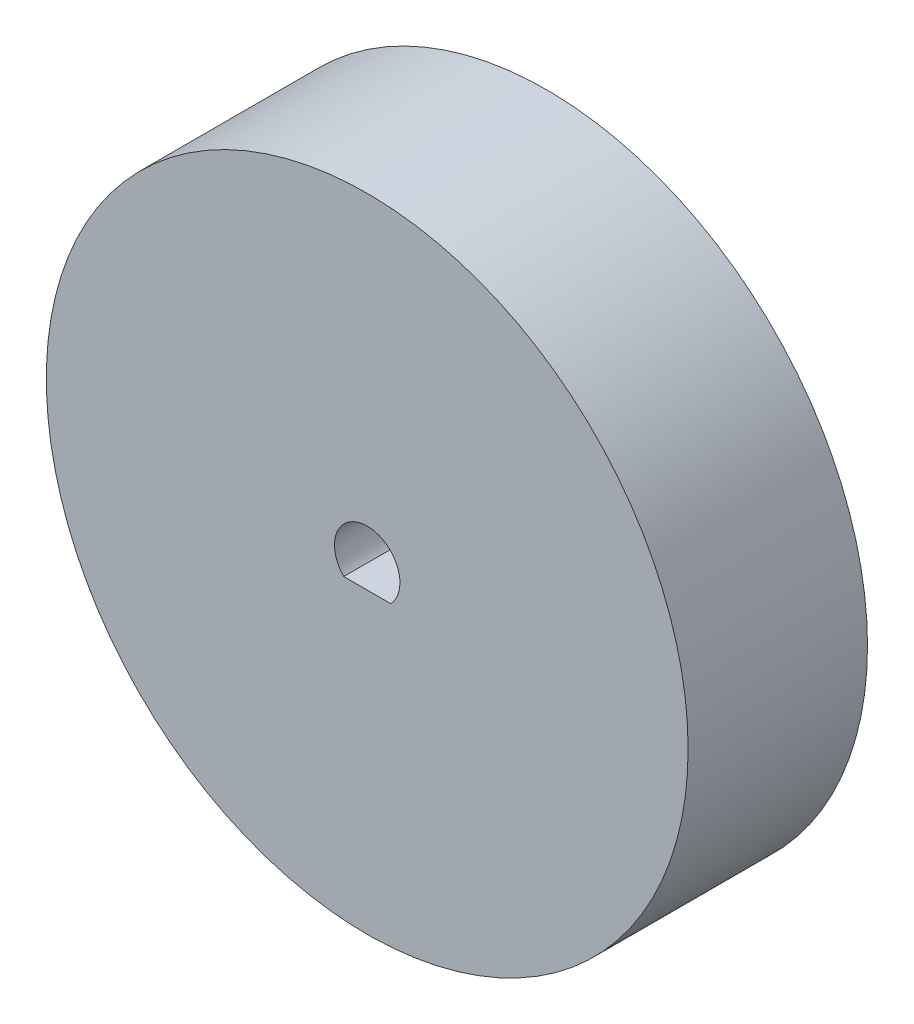
ISO-10303-21;
HEADER;
FILE_DESCRIPTION(('STEP AP214'),'2;1');
FILE_NAME('part.step','',(''),(''),'','','');
FILE_SCHEMA(('AUTOMOTIVE_DESIGN { 1 0 10303 214 1 1 1 1 }'));
ENDSEC;
DATA;
#1=APPLICATION_CONTEXT('core data for automotive mechanical design processes');
#2=APPLICATION_PROTOCOL_DEFINITION('international standard','automotive_design',2000,#1);
#3=PRODUCT_CONTEXT('',#1,'mechanical');
#4=PRODUCT('Part','Part','',(#3));
#5=PRODUCT_RELATED_PRODUCT_CATEGORY('part','',(#4));
#6=PRODUCT_DEFINITION_FORMATION('','',#4);
#7=PRODUCT_DEFINITION_CONTEXT('part definition',#1,'design');
#8=PRODUCT_DEFINITION('design','',#6,#7);
#9=PRODUCT_DEFINITION_SHAPE('','',#8);
#10=(LENGTH_UNIT() NAMED_UNIT(*) SI_UNIT(.MILLI.,.METRE.));
#11=(NAMED_UNIT(*) PLANE_ANGLE_UNIT() SI_UNIT($,.RADIAN.));
#12=(NAMED_UNIT(*) SI_UNIT($,.STERADIAN.) SOLID_ANGLE_UNIT());
#13=UNCERTAINTY_MEASURE_WITH_UNIT(LENGTH_MEASURE(1.E-05),#10,'distance_accuracy_value','');
#14=(GEOMETRIC_REPRESENTATION_CONTEXT(3) GLOBAL_UNCERTAINTY_ASSIGNED_CONTEXT((#13)) GLOBAL_UNIT_ASSIGNED_CONTEXT((#10,
#11,#12)) REPRESENTATION_CONTEXT('',''));
#15=CARTESIAN_POINT('',(0.,0.,0.));
#16=DIRECTION('',(0.,0.,1.));
#17=DIRECTION('',(1.,0.,0.));
#18=AXIS2_PLACEMENT_3D('',#15,#16,#17);
#19=CARTESIAN_POINT('',(0.,0.,9.));
#20=DIRECTION('',(0.,0.,1.));
#21=DIRECTION('',(1.,0.,0.));
#22=AXIS2_PLACEMENT_3D('',#19,#20,#21);
#23=PLANE('',#22);
#24=CARTESIAN_POINT('',(0.,0.,9.));
#25=DIRECTION('',(0.,0.,1.));
#26=DIRECTION('',(1.,0.,0.));
#27=AXIS2_PLACEMENT_3D('',#24,#25,#26);
#28=CIRCLE('',#27,16.1);
#29=CARTESIAN_POINT('',(16.1,0.,9.));
#30=VERTEX_POINT('',#29);
#31=EDGE_CURVE('E11',#30,#30,#28,.T.);
#32=ORIENTED_EDGE('',*,*,#31,.T.);
#33=EDGE_LOOP('',(#32));
#34=FACE_BOUND('',#33,.T.);
#35=DIRECTION('',(1.,0.,0.));
#36=VECTOR('',#35,1.);
#37=CARTESIAN_POINT('',(-1.17898261225516,-1.14,9.));
#38=LINE('',#37,#36);
#39=CARTESIAN_POINT('',(-1.17898261225516,-1.14,9.));
#40=VERTEX_POINT('',#39);
#41=CARTESIAN_POINT('',(1.17898261225516,-1.14,9.));
#42=VERTEX_POINT('',#41);
#43=EDGE_CURVE('E78',#40,#42,#38,.T.);
#44=ORIENTED_EDGE('',*,*,#43,.F.);
#45=CARTESIAN_POINT('',(0.,0.,9.));
#46=DIRECTION('',(0.,0.,1.));
#47=DIRECTION('',(1.,0.,0.));
#48=AXIS2_PLACEMENT_3D('',#45,#46,#47);
#49=CIRCLE('',#48,1.64);
#50=EDGE_CURVE('E69',#42,#40,#49,.T.);
#51=ORIENTED_EDGE('',*,*,#50,.F.);
#52=EDGE_LOOP('',(#44,#51));
#53=FACE_BOUND('',#52,.T.);
#54=ADVANCED_FACE('F37',(#34,#53),#23,.T.);
#55=CARTESIAN_POINT('',(0.,0.,0.));
#56=DIRECTION('',(0.,0.,1.));
#57=DIRECTION('',(1.,0.,0.));
#58=AXIS2_PLACEMENT_3D('',#55,#56,#57);
#59=PLANE('',#58);
#60=CARTESIAN_POINT('',(0.,0.,0.));
#61=DIRECTION('',(0.,0.,1.));
#62=DIRECTION('',(1.,0.,0.));
#63=AXIS2_PLACEMENT_3D('',#60,#61,#62);
#64=CIRCLE('',#63,16.1);
#65=CARTESIAN_POINT('',(16.1,0.,0.));
#66=VERTEX_POINT('',#65);
#67=EDGE_CURVE('E41',#66,#66,#64,.T.);
#68=ORIENTED_EDGE('',*,*,#67,.F.);
#69=EDGE_LOOP('',(#68));
#70=FACE_BOUND('',#69,.T.);
#71=CARTESIAN_POINT('',(0.,0.,0.));
#72=DIRECTION('',(0.,0.,1.));
#73=DIRECTION('',(1.,0.,0.));
#74=AXIS2_PLACEMENT_3D('',#71,#72,#73);
#75=CIRCLE('',#74,1.64);
#76=CARTESIAN_POINT('',(1.17898261225516,-1.14,0.));
#77=VERTEX_POINT('',#76);
#78=CARTESIAN_POINT('',(-1.17898261225516,-1.14,0.));
#79=VERTEX_POINT('',#78);
#80=EDGE_CURVE('E59',#77,#79,#75,.T.);
#81=ORIENTED_EDGE('',*,*,#80,.T.);
#82=DIRECTION('',(1.,0.,0.));
#83=VECTOR('',#82,1.);
#84=CARTESIAN_POINT('',(-1.17898261225516,-1.14,0.));
#85=LINE('',#84,#83);
#86=EDGE_CURVE('E65',#79,#77,#85,.T.);
#87=ORIENTED_EDGE('',*,*,#86,.T.);
#88=EDGE_LOOP('',(#81,#87));
#89=FACE_BOUND('',#88,.T.);
#90=ADVANCED_FACE('F75',(#70,#89),#59,.F.);
#91=CARTESIAN_POINT('',(0.,0.,9.));
#92=DIRECTION('',(0.,0.,-1.));
#93=DIRECTION('',(-1.,0.,0.));
#94=AXIS2_PLACEMENT_3D('',#91,#92,#93);
#95=CYLINDRICAL_SURFACE('',#94,16.1);
#96=ORIENTED_EDGE('',*,*,#31,.F.);
#97=EDGE_LOOP('',(#96));
#98=FACE_BOUND('',#97,.T.);
#99=ORIENTED_EDGE('',*,*,#67,.T.);
#100=EDGE_LOOP('',(#99));
#101=FACE_BOUND('',#100,.T.);
#102=ADVANCED_FACE('F39',(#98,#101),#95,.T.);
#103=CARTESIAN_POINT('',(0.,0.,9.));
#104=DIRECTION('',(0.,0.,-1.));
#105=DIRECTION('',(-1.,0.,0.));
#106=AXIS2_PLACEMENT_3D('',#103,#104,#105);
#107=CYLINDRICAL_SURFACE('',#106,1.64);
#108=ORIENTED_EDGE('',*,*,#80,.F.);
#109=DIRECTION('',(0.,0.,-1.));
#110=VECTOR('',#109,1.);
#111=CARTESIAN_POINT('',(1.17898261225516,-1.14,9.));
#112=LINE('',#111,#110);
#113=EDGE_CURVE('E67',#42,#77,#112,.T.);
#114=ORIENTED_EDGE('',*,*,#113,.F.);
#115=ORIENTED_EDGE('',*,*,#50,.T.);
#116=DIRECTION('',(0.,0.,-1.));
#117=VECTOR('',#116,1.);
#118=CARTESIAN_POINT('',(-1.17898261225516,-1.14,9.));
#119=LINE('',#118,#117);
#120=EDGE_CURVE('E52',#40,#79,#119,.T.);
#121=ORIENTED_EDGE('',*,*,#120,.T.);
#122=EDGE_LOOP('',(#108,#114,#115,#121));
#123=FACE_BOUND('',#122,.T.);
#124=ADVANCED_FACE('F71',(#123),#107,.F.);
#125=CARTESIAN_POINT('',(-1.17898261225516,-1.14,9.));
#126=DIRECTION('',(0.,1.,0.));
#127=DIRECTION('',(0.,0.,1.));
#128=AXIS2_PLACEMENT_3D('',#125,#126,#127);
#129=PLANE('',#128);
#130=ORIENTED_EDGE('',*,*,#86,.F.);
#131=ORIENTED_EDGE('',*,*,#120,.F.);
#132=ORIENTED_EDGE('',*,*,#43,.T.);
#133=ORIENTED_EDGE('',*,*,#113,.T.);
#134=EDGE_LOOP('',(#130,#131,#132,#133));
#135=FACE_BOUND('',#134,.T.);
#136=ADVANCED_FACE('F66',(#135),#129,.T.);
#137=CLOSED_SHELL('',(#54,#90,#102,#124,#136));
#138=MANIFOLD_SOLID_BREP('B2',#137);
#139=ADVANCED_BREP_SHAPE_REPRESENTATION('',(#18,#138),#14);
#140=SHAPE_DEFINITION_REPRESENTATION(#9,#139);
ENDSEC;
END-ISO-10303-21;
